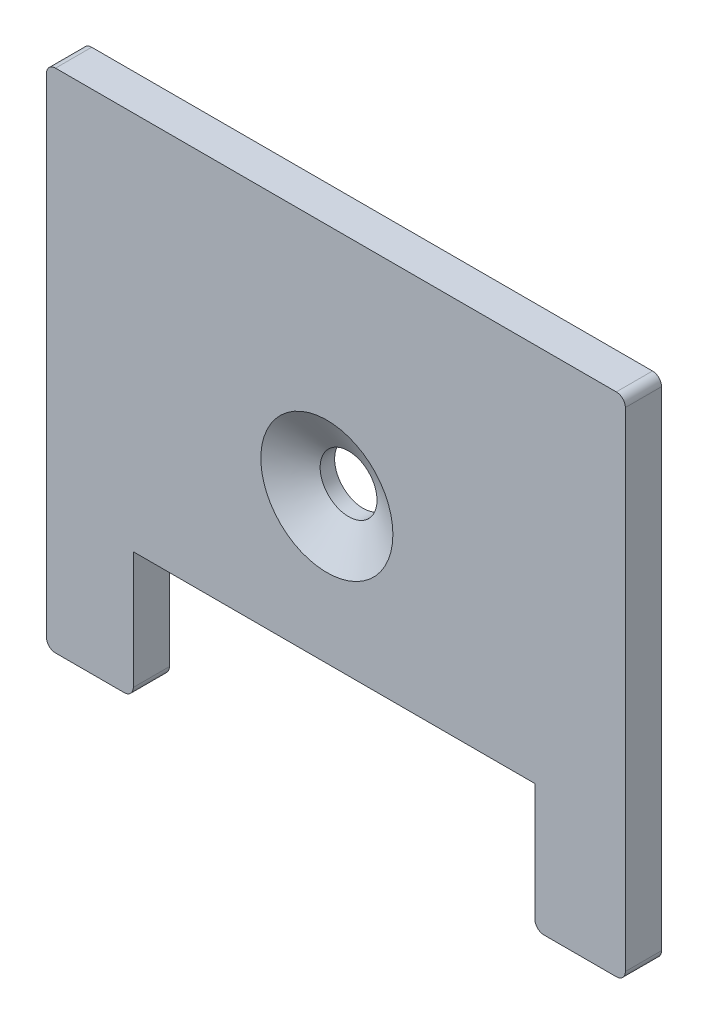
ISO-10303-21;
HEADER;
FILE_DESCRIPTION(('STEP AP214'),'2;1');
FILE_NAME('part.step','',(''),(''),'','','');
FILE_SCHEMA(('AUTOMOTIVE_DESIGN { 1 0 10303 214 1 1 1 1 }'));
ENDSEC;
DATA;
#1=APPLICATION_CONTEXT('core data for automotive mechanical design processes');
#2=APPLICATION_PROTOCOL_DEFINITION('international standard','automotive_design',2000,#1);
#3=PRODUCT_CONTEXT('',#1,'mechanical');
#4=PRODUCT('Part','Part','',(#3));
#5=PRODUCT_RELATED_PRODUCT_CATEGORY('part','',(#4));
#6=PRODUCT_DEFINITION_FORMATION('','',#4);
#7=PRODUCT_DEFINITION_CONTEXT('part definition',#1,'design');
#8=PRODUCT_DEFINITION('design','',#6,#7);
#9=PRODUCT_DEFINITION_SHAPE('','',#8);
#10=(LENGTH_UNIT() NAMED_UNIT(*) SI_UNIT(.MILLI.,.METRE.));
#11=(NAMED_UNIT(*) PLANE_ANGLE_UNIT() SI_UNIT($,.RADIAN.));
#12=(NAMED_UNIT(*) SI_UNIT($,.STERADIAN.) SOLID_ANGLE_UNIT());
#13=UNCERTAINTY_MEASURE_WITH_UNIT(LENGTH_MEASURE(1.E-05),#10,'distance_accuracy_value','');
#14=(GEOMETRIC_REPRESENTATION_CONTEXT(3) GLOBAL_UNCERTAINTY_ASSIGNED_CONTEXT((#13)) GLOBAL_UNIT_ASSIGNED_CONTEXT((#10,
#11,#12)) REPRESENTATION_CONTEXT('',''));
#15=CARTESIAN_POINT('',(0.,0.,0.));
#16=DIRECTION('',(0.,0.,1.));
#17=DIRECTION('',(1.,0.,0.));
#18=AXIS2_PLACEMENT_3D('',#15,#16,#17);
#19=CARTESIAN_POINT('',(-15.5,-13.5,4.6072));
#20=DIRECTION('',(0.,0.,-1.));
#21=DIRECTION('',(-1.,0.,0.));
#22=AXIS2_PLACEMENT_3D('',#19,#20,#21);
#23=CYLINDRICAL_SURFACE('',#22,0.5);
#24=DIRECTION('',(0.,0.,1.));
#25=VECTOR('',#24,1.);
#26=CARTESIAN_POINT('',(-16.,-13.5,0.));
#27=LINE('',#26,#25);
#28=CARTESIAN_POINT('',(-16.,-13.5,0.));
#29=VERTEX_POINT('',#28);
#30=CARTESIAN_POINT('',(-16.,-13.5,2.));
#31=VERTEX_POINT('',#30);
#32=EDGE_CURVE('E178',#29,#31,#27,.T.);
#33=ORIENTED_EDGE('',*,*,#32,.F.);
#34=CARTESIAN_POINT('',(-15.5,-13.5,0.));
#35=DIRECTION('',(0.,0.,-1.));
#36=DIRECTION('',(-1.,0.,0.));
#37=AXIS2_PLACEMENT_3D('',#34,#35,#36);
#38=CIRCLE('',#37,0.5);
#39=CARTESIAN_POINT('',(-15.5,-14.,0.));
#40=VERTEX_POINT('',#39);
#41=EDGE_CURVE('E20',#29,#40,#38,.F.);
#42=ORIENTED_EDGE('',*,*,#41,.T.);
#43=DIRECTION('',(0.,0.,-1.));
#44=VECTOR('',#43,1.);
#45=CARTESIAN_POINT('',(-15.5,-14.,0.));
#46=LINE('',#45,#44);
#47=CARTESIAN_POINT('',(-15.5,-14.,2.));
#48=VERTEX_POINT('',#47);
#49=EDGE_CURVE('E176',#48,#40,#46,.T.);
#50=ORIENTED_EDGE('',*,*,#49,.F.);
#51=CARTESIAN_POINT('',(-15.5,-13.5,2.));
#52=DIRECTION('',(0.,0.,-1.));
#53=DIRECTION('',(-1.,0.,0.));
#54=AXIS2_PLACEMENT_3D('',#51,#52,#53);
#55=CIRCLE('',#54,0.5);
#56=EDGE_CURVE('E192',#31,#48,#55,.F.);
#57=ORIENTED_EDGE('',*,*,#56,.F.);
#58=EDGE_LOOP('',(#33,#42,#50,#57));
#59=FACE_BOUND('',#58,.T.);
#60=ADVANCED_FACE('F17',(#59),#23,.T.);
#61=CARTESIAN_POINT('',(-11.7,-13.5,-2.6072));
#62=DIRECTION('',(0.,0.,1.));
#63=DIRECTION('',(1.,0.,0.));
#64=AXIS2_PLACEMENT_3D('',#61,#62,#63);
#65=CYLINDRICAL_SURFACE('',#64,0.5);
#66=DIRECTION('',(0.,0.,1.));
#67=VECTOR('',#66,1.);
#68=CARTESIAN_POINT('',(-11.2,-13.5,2.));
#69=LINE('',#68,#67);
#70=CARTESIAN_POINT('',(-11.2,-13.5,0.));
#71=VERTEX_POINT('',#70);
#72=CARTESIAN_POINT('',(-11.2,-13.5,2.));
#73=VERTEX_POINT('',#72);
#74=EDGE_CURVE('E170',#71,#73,#69,.T.);
#75=ORIENTED_EDGE('',*,*,#74,.T.);
#76=CARTESIAN_POINT('',(-11.7,-13.5,2.));
#77=DIRECTION('',(0.,0.,1.));
#78=DIRECTION('',(1.,0.,0.));
#79=AXIS2_PLACEMENT_3D('',#76,#77,#78);
#80=CIRCLE('',#79,0.5);
#81=CARTESIAN_POINT('',(-11.7,-14.,2.));
#82=VERTEX_POINT('',#81);
#83=EDGE_CURVE('E190',#82,#73,#80,.T.);
#84=ORIENTED_EDGE('',*,*,#83,.F.);
#85=DIRECTION('',(0.,0.,-1.));
#86=VECTOR('',#85,1.);
#87=CARTESIAN_POINT('',(-11.7,-14.,0.));
#88=LINE('',#87,#86);
#89=CARTESIAN_POINT('',(-11.7,-14.,0.));
#90=VERTEX_POINT('',#89);
#91=EDGE_CURVE('E213',#90,#82,#88,.F.);
#92=ORIENTED_EDGE('',*,*,#91,.F.);
#93=CARTESIAN_POINT('',(-11.7,-13.5,0.));
#94=DIRECTION('',(0.,0.,1.));
#95=DIRECTION('',(1.,0.,0.));
#96=AXIS2_PLACEMENT_3D('',#93,#94,#95);
#97=CIRCLE('',#96,0.5);
#98=EDGE_CURVE('E197',#90,#71,#97,.T.);
#99=ORIENTED_EDGE('',*,*,#98,.T.);
#100=EDGE_LOOP('',(#75,#84,#92,#99));
#101=FACE_BOUND('',#100,.T.);
#102=ADVANCED_FACE('F257',(#101),#65,.T.);
#103=CARTESIAN_POINT('',(11.5,-13.5,4.6072));
#104=DIRECTION('',(0.,0.,-1.));
#105=DIRECTION('',(-1.,0.,0.));
#106=AXIS2_PLACEMENT_3D('',#103,#104,#105);
#107=CYLINDRICAL_SURFACE('',#106,0.5);
#108=DIRECTION('',(0.,0.,-1.));
#109=VECTOR('',#108,1.);
#110=CARTESIAN_POINT('',(11.,-13.5,2.));
#111=LINE('',#110,#109);
#112=CARTESIAN_POINT('',(11.,-13.5,2.));
#113=VERTEX_POINT('',#112);
#114=CARTESIAN_POINT('',(11.,-13.5,0.));
#115=VERTEX_POINT('',#114);
#116=EDGE_CURVE('E163',#113,#115,#111,.T.);
#117=ORIENTED_EDGE('',*,*,#116,.T.);
#118=CARTESIAN_POINT('',(11.5,-13.5,0.));
#119=DIRECTION('',(0.,0.,-1.));
#120=DIRECTION('',(-1.,0.,0.));
#121=AXIS2_PLACEMENT_3D('',#118,#119,#120);
#122=CIRCLE('',#121,0.5);
#123=CARTESIAN_POINT('',(11.5,-14.,0.));
#124=VERTEX_POINT('',#123);
#125=EDGE_CURVE('E196',#115,#124,#122,.F.);
#126=ORIENTED_EDGE('',*,*,#125,.T.);
#127=DIRECTION('',(0.,0.,-1.));
#128=VECTOR('',#127,1.);
#129=CARTESIAN_POINT('',(11.5,-14.,0.));
#130=LINE('',#129,#128);
#131=CARTESIAN_POINT('',(11.5,-14.,2.));
#132=VERTEX_POINT('',#131);
#133=EDGE_CURVE('E153',#132,#124,#130,.T.);
#134=ORIENTED_EDGE('',*,*,#133,.F.);
#135=CARTESIAN_POINT('',(11.5,-13.5,2.));
#136=DIRECTION('',(0.,0.,-1.));
#137=DIRECTION('',(-1.,0.,0.));
#138=AXIS2_PLACEMENT_3D('',#135,#136,#137);
#139=CIRCLE('',#138,0.5);
#140=EDGE_CURVE('E188',#113,#132,#139,.F.);
#141=ORIENTED_EDGE('',*,*,#140,.F.);
#142=EDGE_LOOP('',(#117,#126,#134,#141));
#143=FACE_BOUND('',#142,.T.);
#144=ADVANCED_FACE('F259',(#143),#107,.T.);
#145=CARTESIAN_POINT('',(15.5,-13.5,4.6072));
#146=DIRECTION('',(0.,0.,-1.));
#147=DIRECTION('',(-1.,0.,0.));
#148=AXIS2_PLACEMENT_3D('',#145,#146,#147);
#149=CYLINDRICAL_SURFACE('',#148,0.5);
#150=DIRECTION('',(0.,0.,-1.));
#151=VECTOR('',#150,1.);
#152=CARTESIAN_POINT('',(15.5,-14.,0.));
#153=LINE('',#152,#151);
#154=CARTESIAN_POINT('',(15.5,-14.,0.));
#155=VERTEX_POINT('',#154);
#156=CARTESIAN_POINT('',(15.5,-14.,2.));
#157=VERTEX_POINT('',#156);
#158=EDGE_CURVE('E149',#155,#157,#153,.F.);
#159=ORIENTED_EDGE('',*,*,#158,.F.);
#160=CARTESIAN_POINT('',(15.5,-13.5,0.));
#161=DIRECTION('',(0.,0.,-1.));
#162=DIRECTION('',(-1.,0.,0.));
#163=AXIS2_PLACEMENT_3D('',#160,#161,#162);
#164=CIRCLE('',#163,0.5);
#165=CARTESIAN_POINT('',(16.,-13.5,0.));
#166=VERTEX_POINT('',#165);
#167=EDGE_CURVE('E194',#155,#166,#164,.F.);
#168=ORIENTED_EDGE('',*,*,#167,.T.);
#169=DIRECTION('',(0.,0.,-1.));
#170=VECTOR('',#169,1.);
#171=CARTESIAN_POINT('',(16.,-13.5,0.));
#172=LINE('',#171,#170);
#173=CARTESIAN_POINT('',(16.,-13.5,2.));
#174=VERTEX_POINT('',#173);
#175=EDGE_CURVE('E141',#174,#166,#172,.T.);
#176=ORIENTED_EDGE('',*,*,#175,.F.);
#177=CARTESIAN_POINT('',(15.5,-13.5,2.));
#178=DIRECTION('',(0.,0.,-1.));
#179=DIRECTION('',(-1.,0.,0.));
#180=AXIS2_PLACEMENT_3D('',#177,#178,#179);
#181=CIRCLE('',#180,0.5);
#182=EDGE_CURVE('E186',#157,#174,#181,.F.);
#183=ORIENTED_EDGE('',*,*,#182,.F.);
#184=EDGE_LOOP('',(#159,#168,#176,#183));
#185=FACE_BOUND('',#184,.T.);
#186=ADVANCED_FACE('F265',(#185),#149,.T.);
#187=CARTESIAN_POINT('',(0.,0.,2.));
#188=DIRECTION('',(0.,0.,1.));
#189=DIRECTION('',(1.,0.,0.));
#190=AXIS2_PLACEMENT_3D('',#187,#188,#189);
#191=PLANE('',#190);
#192=CARTESIAN_POINT('',(-0.5,1.,2.00000000000955));
#193=DIRECTION('',(0.,0.,1.));
#194=DIRECTION('',(1.,0.,0.));
#195=AXIS2_PLACEMENT_3D('',#192,#193,#194);
#196=CIRCLE('',#195,3.65000000003829);
#197=CARTESIAN_POINT('',(3.15000000003829,1.,2.00000000000955));
#198=VERTEX_POINT('',#197);
#199=EDGE_CURVE('E180',#198,#198,#196,.F.);
#200=ORIENTED_EDGE('',*,*,#199,.T.);
#201=EDGE_LOOP('',(#200));
#202=FACE_BOUND('',#201,.T.);
#203=DIRECTION('',(1.,0.,0.));
#204=VECTOR('',#203,1.);
#205=CARTESIAN_POINT('',(16.,14.,2.));
#206=LINE('',#205,#204);
#207=CARTESIAN_POINT('',(-15.5,14.,2.));
#208=VERTEX_POINT('',#207);
#209=CARTESIAN_POINT('',(15.5,14.,2.));
#210=VERTEX_POINT('',#209);
#211=EDGE_CURVE('E128',#208,#210,#206,.T.);
#212=ORIENTED_EDGE('',*,*,#211,.F.);
#213=CARTESIAN_POINT('',(-15.5,13.5,2.));
#214=DIRECTION('',(0.,0.,-1.));
#215=DIRECTION('',(-1.,0.,0.));
#216=AXIS2_PLACEMENT_3D('',#213,#214,#215);
#217=CIRCLE('',#216,0.5);
#218=CARTESIAN_POINT('',(-16.,13.5,2.));
#219=VERTEX_POINT('',#218);
#220=EDGE_CURVE('E116',#219,#208,#217,.T.);
#221=ORIENTED_EDGE('',*,*,#220,.F.);
#222=DIRECTION('',(0.,1.,0.));
#223=VECTOR('',#222,1.);
#224=CARTESIAN_POINT('',(-16.,14.,2.));
#225=LINE('',#224,#223);
#226=EDGE_CURVE('E177',#31,#219,#225,.T.);
#227=ORIENTED_EDGE('',*,*,#226,.F.);
#228=ORIENTED_EDGE('',*,*,#56,.T.);
#229=DIRECTION('',(1.,0.,0.));
#230=VECTOR('',#229,1.);
#231=CARTESIAN_POINT('',(-16.,-14.,2.));
#232=LINE('',#231,#230);
#233=EDGE_CURVE('E173',#82,#48,#232,.F.);
#234=ORIENTED_EDGE('',*,*,#233,.F.);
#235=ORIENTED_EDGE('',*,*,#83,.T.);
#236=DIRECTION('',(0.,1.,0.));
#237=VECTOR('',#236,1.);
#238=CARTESIAN_POINT('',(-11.2,-7.,2.));
#239=LINE('',#238,#237);
#240=CARTESIAN_POINT('',(-11.2,-7.,2.));
#241=VERTEX_POINT('',#240);
#242=EDGE_CURVE('E167',#73,#241,#239,.T.);
#243=ORIENTED_EDGE('',*,*,#242,.T.);
#244=DIRECTION('',(1.,0.,0.));
#245=VECTOR('',#244,1.);
#246=CARTESIAN_POINT('',(11.,-7.,2.));
#247=LINE('',#246,#245);
#248=CARTESIAN_POINT('',(11.,-7.,2.));
#249=VERTEX_POINT('',#248);
#250=EDGE_CURVE('E160',#241,#249,#247,.T.);
#251=ORIENTED_EDGE('',*,*,#250,.T.);
#252=DIRECTION('',(0.,1.,0.));
#253=VECTOR('',#252,1.);
#254=CARTESIAN_POINT('',(11.,-15.99925820819,2.));
#255=LINE('',#254,#253);
#256=EDGE_CURVE('E154',#249,#113,#255,.F.);
#257=ORIENTED_EDGE('',*,*,#256,.T.);
#258=ORIENTED_EDGE('',*,*,#140,.T.);
#259=DIRECTION('',(1.,0.,0.));
#260=VECTOR('',#259,1.);
#261=CARTESIAN_POINT('',(-16.,-14.,2.));
#262=LINE('',#261,#260);
#263=EDGE_CURVE('E150',#157,#132,#262,.F.);
#264=ORIENTED_EDGE('',*,*,#263,.F.);
#265=ORIENTED_EDGE('',*,*,#182,.T.);
#266=DIRECTION('',(0.,1.,0.));
#267=VECTOR('',#266,1.);
#268=CARTESIAN_POINT('',(16.,-14.,2.));
#269=LINE('',#268,#267);
#270=CARTESIAN_POINT('',(16.,13.5,2.));
#271=VERTEX_POINT('',#270);
#272=EDGE_CURVE('E146',#271,#174,#269,.F.);
#273=ORIENTED_EDGE('',*,*,#272,.F.);
#274=CARTESIAN_POINT('',(15.5,13.5,2.));
#275=DIRECTION('',(0.,0.,-1.));
#276=DIRECTION('',(-1.,0.,0.));
#277=AXIS2_PLACEMENT_3D('',#274,#275,#276);
#278=CIRCLE('',#277,0.5);
#279=EDGE_CURVE('E136',#210,#271,#278,.T.);
#280=ORIENTED_EDGE('',*,*,#279,.F.);
#281=EDGE_LOOP('',(#212,#221,#227,#228,#234,#235,#243,#251,#257,#258,#264,#265,#273,#280));
#282=FACE_BOUND('',#281,.T.);
#283=ADVANCED_FACE('F134',(#202,#282),#191,.T.);
#284=CARTESIAN_POINT('',(15.5,13.5,4.6072));
#285=DIRECTION('',(0.,0.,-1.));
#286=DIRECTION('',(-1.,0.,0.));
#287=AXIS2_PLACEMENT_3D('',#284,#285,#286);
#288=CYLINDRICAL_SURFACE('',#287,0.5);
#289=DIRECTION('',(0.,0.,-1.));
#290=VECTOR('',#289,1.);
#291=CARTESIAN_POINT('',(16.,13.5,0.));
#292=LINE('',#291,#290);
#293=CARTESIAN_POINT('',(16.,13.5,0.));
#294=VERTEX_POINT('',#293);
#295=EDGE_CURVE('E137',#294,#271,#292,.F.);
#296=ORIENTED_EDGE('',*,*,#295,.F.);
#297=CARTESIAN_POINT('',(15.5,13.5,0.));
#298=DIRECTION('',(0.,0.,-1.));
#299=DIRECTION('',(-1.,0.,0.));
#300=AXIS2_PLACEMENT_3D('',#297,#298,#299);
#301=CIRCLE('',#300,0.5);
#302=CARTESIAN_POINT('',(15.5,14.,0.));
#303=VERTEX_POINT('',#302);
#304=EDGE_CURVE('E35',#294,#303,#301,.F.);
#305=ORIENTED_EDGE('',*,*,#304,.T.);
#306=DIRECTION('',(0.,0.,1.));
#307=VECTOR('',#306,1.);
#308=CARTESIAN_POINT('',(15.5,14.,0.));
#309=LINE('',#308,#307);
#310=EDGE_CURVE('E132',#210,#303,#309,.F.);
#311=ORIENTED_EDGE('',*,*,#310,.F.);
#312=ORIENTED_EDGE('',*,*,#279,.T.);
#313=EDGE_LOOP('',(#296,#305,#311,#312));
#314=FACE_BOUND('',#313,.T.);
#315=ADVANCED_FACE('F309',(#314),#288,.T.);
#316=CARTESIAN_POINT('',(-15.5,13.5,4.6072));
#317=DIRECTION('',(0.,0.,-1.));
#318=DIRECTION('',(-1.,0.,0.));
#319=AXIS2_PLACEMENT_3D('',#316,#317,#318);
#320=CYLINDRICAL_SURFACE('',#319,0.5);
#321=DIRECTION('',(0.,0.,1.));
#322=VECTOR('',#321,1.);
#323=CARTESIAN_POINT('',(-15.5,14.,0.));
#324=LINE('',#323,#322);
#325=CARTESIAN_POINT('',(-15.5,14.,0.));
#326=VERTEX_POINT('',#325);
#327=EDGE_CURVE('E119',#326,#208,#324,.T.);
#328=ORIENTED_EDGE('',*,*,#327,.F.);
#329=CARTESIAN_POINT('',(-15.5,13.5,0.));
#330=DIRECTION('',(0.,0.,-1.));
#331=DIRECTION('',(-1.,0.,0.));
#332=AXIS2_PLACEMENT_3D('',#329,#330,#331);
#333=CIRCLE('',#332,0.5);
#334=CARTESIAN_POINT('',(-16.,13.5,0.));
#335=VERTEX_POINT('',#334);
#336=EDGE_CURVE('E108',#326,#335,#333,.F.);
#337=ORIENTED_EDGE('',*,*,#336,.T.);
#338=DIRECTION('',(0.,0.,1.));
#339=VECTOR('',#338,1.);
#340=CARTESIAN_POINT('',(-16.,13.5,0.));
#341=LINE('',#340,#339);
#342=EDGE_CURVE('E121',#219,#335,#341,.F.);
#343=ORIENTED_EDGE('',*,*,#342,.F.);
#344=ORIENTED_EDGE('',*,*,#220,.T.);
#345=EDGE_LOOP('',(#328,#337,#343,#344));
#346=FACE_BOUND('',#345,.T.);
#347=ADVANCED_FACE('F118',(#346),#320,.T.);
#348=CARTESIAN_POINT('',(-0.5,1.,2.00000000000955));
#349=DIRECTION('',(0.,0.,1.));
#350=DIRECTION('',(1.,0.,0.));
#351=AXIS2_PLACEMENT_3D('',#348,#349,#350);
#352=CONICAL_SURFACE('',#351,3.65000000003829,1.04719755120085);
#353=CARTESIAN_POINT('',(-0.5,1.,0.8));
#354=DIRECTION('',(0.,0.,1.));
#355=DIRECTION('',(1.,0.,0.));
#356=AXIS2_PLACEMENT_3D('',#353,#354,#355);
#357=CIRCLE('',#356,1.571539030917);
#358=CARTESIAN_POINT('',(1.071539030917,1.,0.8));
#359=VERTEX_POINT('',#358);
#360=EDGE_CURVE('E131',#359,#359,#357,.F.);
#361=ORIENTED_EDGE('',*,*,#360,.T.);
#362=EDGE_LOOP('',(#361));
#363=FACE_BOUND('',#362,.T.);
#364=ORIENTED_EDGE('',*,*,#199,.F.);
#365=EDGE_LOOP('',(#364));
#366=FACE_BOUND('',#365,.T.);
#367=ADVANCED_FACE('F303',(#363,#366),#352,.F.);
#368=CARTESIAN_POINT('',(-16.,14.,0.));
#369=DIRECTION('',(-1.,0.,0.));
#370=DIRECTION('',(0.,0.,1.));
#371=AXIS2_PLACEMENT_3D('',#368,#369,#370);
#372=PLANE('',#371);
#373=ORIENTED_EDGE('',*,*,#226,.T.);
#374=ORIENTED_EDGE('',*,*,#342,.T.);
#375=DIRECTION('',(0.,1.,0.));
#376=VECTOR('',#375,1.);
#377=CARTESIAN_POINT('',(-16.,0.,0.));
#378=LINE('',#377,#376);
#379=EDGE_CURVE('E218',#335,#29,#378,.F.);
#380=ORIENTED_EDGE('',*,*,#379,.T.);
#381=ORIENTED_EDGE('',*,*,#32,.T.);
#382=EDGE_LOOP('',(#373,#374,#380,#381));
#383=FACE_BOUND('',#382,.T.);
#384=ADVANCED_FACE('F251',(#383),#372,.T.);
#385=CARTESIAN_POINT('',(-16.,-14.,0.));
#386=DIRECTION('',(0.,-1.,0.));
#387=DIRECTION('',(0.,0.,-1.));
#388=AXIS2_PLACEMENT_3D('',#385,#386,#387);
#389=PLANE('',#388);
#390=DIRECTION('',(1.,0.,0.));
#391=VECTOR('',#390,1.);
#392=CARTESIAN_POINT('',(0.,-14.,0.));
#393=LINE('',#392,#391);
#394=EDGE_CURVE('E211',#40,#90,#393,.T.);
#395=ORIENTED_EDGE('',*,*,#394,.T.);
#396=ORIENTED_EDGE('',*,*,#91,.T.);
#397=ORIENTED_EDGE('',*,*,#233,.T.);
#398=ORIENTED_EDGE('',*,*,#49,.T.);
#399=EDGE_LOOP('',(#395,#396,#397,#398));
#400=FACE_BOUND('',#399,.T.);
#401=ADVANCED_FACE('F209',(#400),#389,.T.);
#402=CARTESIAN_POINT('',(-11.2,-7.,2.));
#403=DIRECTION('',(-1.,0.,0.));
#404=DIRECTION('',(0.,0.,1.));
#405=AXIS2_PLACEMENT_3D('',#402,#403,#404);
#406=PLANE('',#405);
#407=DIRECTION('',(0.,0.,1.));
#408=VECTOR('',#407,1.);
#409=CARTESIAN_POINT('',(-11.2,-7.,2.));
#410=LINE('',#409,#408);
#411=CARTESIAN_POINT('',(-11.2,-7.,0.));
#412=VERTEX_POINT('',#411);
#413=EDGE_CURVE('E164',#412,#241,#410,.T.);
#414=ORIENTED_EDGE('',*,*,#413,.T.);
#415=ORIENTED_EDGE('',*,*,#242,.F.);
#416=ORIENTED_EDGE('',*,*,#74,.F.);
#417=DIRECTION('',(0.,1.,0.));
#418=VECTOR('',#417,1.);
#419=CARTESIAN_POINT('',(-11.2,0.,0.));
#420=LINE('',#419,#418);
#421=EDGE_CURVE('E217',#71,#412,#420,.T.);
#422=ORIENTED_EDGE('',*,*,#421,.T.);
#423=EDGE_LOOP('',(#414,#415,#416,#422));
#424=FACE_BOUND('',#423,.T.);
#425=ADVANCED_FACE('F255',(#424),#406,.F.);
#426=CARTESIAN_POINT('',(11.,-7.,2.));
#427=DIRECTION('',(0.,1.,0.));
#428=DIRECTION('',(0.,0.,1.));
#429=AXIS2_PLACEMENT_3D('',#426,#427,#428);
#430=PLANE('',#429);
#431=ORIENTED_EDGE('',*,*,#250,.F.);
#432=ORIENTED_EDGE('',*,*,#413,.F.);
#433=DIRECTION('',(1.,0.,0.));
#434=VECTOR('',#433,1.);
#435=CARTESIAN_POINT('',(0.,-7.,0.));
#436=LINE('',#435,#434);
#437=CARTESIAN_POINT('',(11.,-7.,0.));
#438=VERTEX_POINT('',#437);
#439=EDGE_CURVE('E221',#412,#438,#436,.T.);
#440=ORIENTED_EDGE('',*,*,#439,.T.);
#441=DIRECTION('',(0.,0.,-1.));
#442=VECTOR('',#441,1.);
#443=CARTESIAN_POINT('',(11.,-7.,2.));
#444=LINE('',#443,#442);
#445=EDGE_CURVE('E157',#438,#249,#444,.F.);
#446=ORIENTED_EDGE('',*,*,#445,.T.);
#447=EDGE_LOOP('',(#431,#432,#440,#446));
#448=FACE_BOUND('',#447,.T.);
#449=ADVANCED_FACE('F292',(#448),#430,.F.);
#450=CARTESIAN_POINT('',(11.,-15.99925820819,2.));
#451=DIRECTION('',(1.,0.,0.));
#452=DIRECTION('',(0.,0.,-1.));
#453=AXIS2_PLACEMENT_3D('',#450,#451,#452);
#454=PLANE('',#453);
#455=ORIENTED_EDGE('',*,*,#445,.F.);
#456=DIRECTION('',(0.,1.,0.));
#457=VECTOR('',#456,1.);
#458=CARTESIAN_POINT('',(11.,0.,0.));
#459=LINE('',#458,#457);
#460=EDGE_CURVE('E241',#438,#115,#459,.F.);
#461=ORIENTED_EDGE('',*,*,#460,.T.);
#462=ORIENTED_EDGE('',*,*,#116,.F.);
#463=ORIENTED_EDGE('',*,*,#256,.F.);
#464=EDGE_LOOP('',(#455,#461,#462,#463));
#465=FACE_BOUND('',#464,.T.);
#466=ADVANCED_FACE('F288',(#465),#454,.F.);
#467=CARTESIAN_POINT('',(-16.,-14.,0.));
#468=DIRECTION('',(0.,-1.,0.));
#469=DIRECTION('',(0.,0.,-1.));
#470=AXIS2_PLACEMENT_3D('',#467,#468,#469);
#471=PLANE('',#470);
#472=DIRECTION('',(1.,0.,0.));
#473=VECTOR('',#472,1.);
#474=CARTESIAN_POINT('',(0.,-14.,0.));
#475=LINE('',#474,#473);
#476=EDGE_CURVE('E324',#124,#155,#475,.T.);
#477=ORIENTED_EDGE('',*,*,#476,.T.);
#478=ORIENTED_EDGE('',*,*,#158,.T.);
#479=ORIENTED_EDGE('',*,*,#263,.T.);
#480=ORIENTED_EDGE('',*,*,#133,.T.);
#481=EDGE_LOOP('',(#477,#478,#479,#480));
#482=FACE_BOUND('',#481,.T.);
#483=ADVANCED_FACE('F284',(#482),#471,.T.);
#484=CARTESIAN_POINT('',(16.,-14.,0.));
#485=DIRECTION('',(1.,0.,0.));
#486=DIRECTION('',(0.,0.,-1.));
#487=AXIS2_PLACEMENT_3D('',#484,#485,#486);
#488=PLANE('',#487);
#489=DIRECTION('',(0.,1.,0.));
#490=VECTOR('',#489,1.);
#491=CARTESIAN_POINT('',(16.,0.,0.));
#492=LINE('',#491,#490);
#493=EDGE_CURVE('E326',#166,#294,#492,.T.);
#494=ORIENTED_EDGE('',*,*,#493,.T.);
#495=ORIENTED_EDGE('',*,*,#295,.T.);
#496=ORIENTED_EDGE('',*,*,#272,.T.);
#497=ORIENTED_EDGE('',*,*,#175,.T.);
#498=EDGE_LOOP('',(#494,#495,#496,#497));
#499=FACE_BOUND('',#498,.T.);
#500=ADVANCED_FACE('F281',(#499),#488,.T.);
#501=CARTESIAN_POINT('',(16.,14.,0.));
#502=DIRECTION('',(0.,1.,0.));
#503=DIRECTION('',(0.,0.,1.));
#504=AXIS2_PLACEMENT_3D('',#501,#502,#503);
#505=PLANE('',#504);
#506=DIRECTION('',(1.,0.,0.));
#507=VECTOR('',#506,1.);
#508=CARTESIAN_POINT('',(0.,14.,0.));
#509=LINE('',#508,#507);
#510=EDGE_CURVE('E26',#303,#326,#509,.F.);
#511=ORIENTED_EDGE('',*,*,#510,.T.);
#512=ORIENTED_EDGE('',*,*,#327,.T.);
#513=ORIENTED_EDGE('',*,*,#211,.T.);
#514=ORIENTED_EDGE('',*,*,#310,.T.);
#515=EDGE_LOOP('',(#511,#512,#513,#514));
#516=FACE_BOUND('',#515,.T.);
#517=ADVANCED_FACE('F127',(#516),#505,.T.);
#518=CARTESIAN_POINT('',(-0.5,1.,-5.143646092362));
#519=DIRECTION('',(0.,0.,1.));
#520=DIRECTION('',(1.,0.,0.));
#521=AXIS2_PLACEMENT_3D('',#518,#519,#520);
#522=CYLINDRICAL_SURFACE('',#521,1.571539030917);
#523=ORIENTED_EDGE('',*,*,#360,.F.);
#524=EDGE_LOOP('',(#523));
#525=FACE_BOUND('',#524,.T.);
#526=CARTESIAN_POINT('',(-0.5,1.,0.));
#527=DIRECTION('',(0.,0.,1.));
#528=DIRECTION('',(1.,0.,0.));
#529=AXIS2_PLACEMENT_3D('',#526,#527,#528);
#530=CIRCLE('',#529,1.571539030917);
#531=CARTESIAN_POINT('',(1.071539030917,1.,0.));
#532=VERTEX_POINT('',#531);
#533=EDGE_CURVE('E11',#532,#532,#530,.F.);
#534=ORIENTED_EDGE('',*,*,#533,.T.);
#535=EDGE_LOOP('',(#534));
#536=FACE_BOUND('',#535,.T.);
#537=ADVANCED_FACE('F269',(#525,#536),#522,.F.);
#538=CARTESIAN_POINT('',(0.,0.,0.));
#539=DIRECTION('',(0.,0.,1.));
#540=DIRECTION('',(1.,0.,0.));
#541=AXIS2_PLACEMENT_3D('',#538,#539,#540);
#542=PLANE('',#541);
#543=ORIENTED_EDGE('',*,*,#533,.F.);
#544=EDGE_LOOP('',(#543));
#545=FACE_BOUND('',#544,.T.);
#546=ORIENTED_EDGE('',*,*,#304,.F.);
#547=ORIENTED_EDGE('',*,*,#493,.F.);
#548=ORIENTED_EDGE('',*,*,#167,.F.);
#549=ORIENTED_EDGE('',*,*,#476,.F.);
#550=ORIENTED_EDGE('',*,*,#125,.F.);
#551=ORIENTED_EDGE('',*,*,#460,.F.);
#552=ORIENTED_EDGE('',*,*,#439,.F.);
#553=ORIENTED_EDGE('',*,*,#421,.F.);
#554=ORIENTED_EDGE('',*,*,#98,.F.);
#555=ORIENTED_EDGE('',*,*,#394,.F.);
#556=ORIENTED_EDGE('',*,*,#41,.F.);
#557=ORIENTED_EDGE('',*,*,#379,.F.);
#558=ORIENTED_EDGE('',*,*,#336,.F.);
#559=ORIENTED_EDGE('',*,*,#510,.F.);
#560=EDGE_LOOP('',(#546,#547,#548,#549,#550,#551,#552,#553,#554,#555,#556,#557,#558,#559));
#561=FACE_BOUND('',#560,.T.);
#562=ADVANCED_FACE('F215',(#545,#561),#542,.F.);
#563=CLOSED_SHELL('',(#60,#102,#144,#186,#283,#315,#347,#367,#384,#401,#425,#449,#466,#483,#500,
#517,#537,#562));
#564=MANIFOLD_SOLID_BREP('B1',#563);
#565=ADVANCED_BREP_SHAPE_REPRESENTATION('',(#18,#564),#14);
#566=SHAPE_DEFINITION_REPRESENTATION(#9,#565);
ENDSEC;
END-ISO-10303-21;
